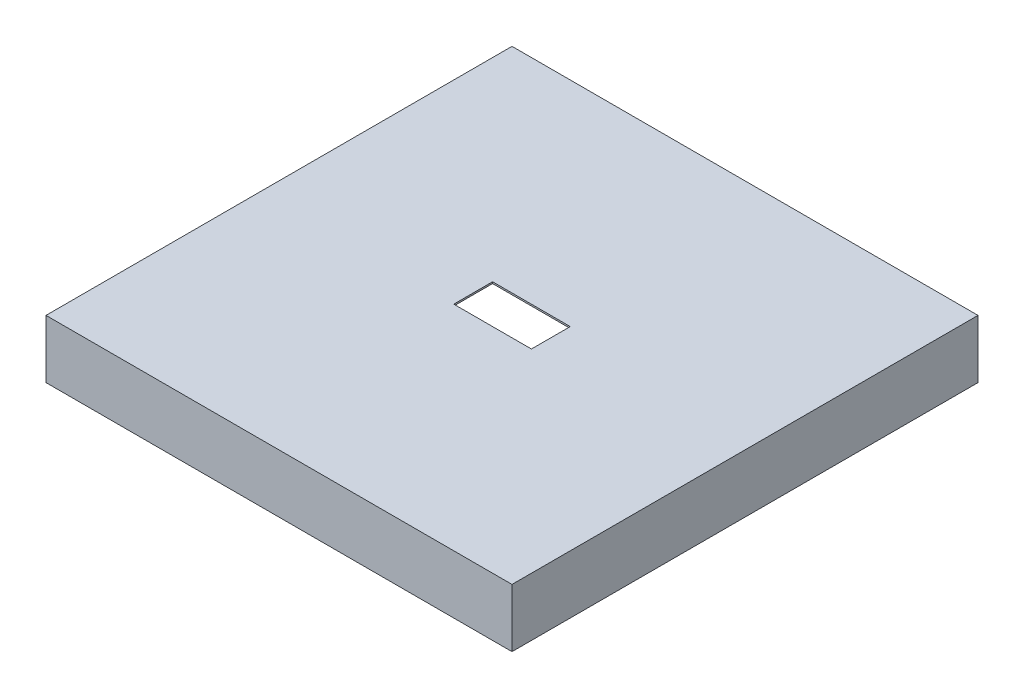
ISO-10303-21;
HEADER;
FILE_DESCRIPTION(('STEP AP214'),'2;1');
FILE_NAME('part.step','',(''),(''),'','','');
FILE_SCHEMA(('AUTOMOTIVE_DESIGN { 1 0 10303 214 1 1 1 1 }'));
ENDSEC;
DATA;
#1=APPLICATION_CONTEXT('core data for automotive mechanical design processes');
#2=APPLICATION_PROTOCOL_DEFINITION('international standard','automotive_design',2000,#1);
#3=PRODUCT_CONTEXT('',#1,'mechanical');
#4=PRODUCT('Part','Part','',(#3));
#5=PRODUCT_RELATED_PRODUCT_CATEGORY('part','',(#4));
#6=PRODUCT_DEFINITION_FORMATION('','',#4);
#7=PRODUCT_DEFINITION_CONTEXT('part definition',#1,'design');
#8=PRODUCT_DEFINITION('design','',#6,#7);
#9=PRODUCT_DEFINITION_SHAPE('','',#8);
#10=(LENGTH_UNIT() NAMED_UNIT(*) SI_UNIT(.MILLI.,.METRE.));
#11=(NAMED_UNIT(*) PLANE_ANGLE_UNIT() SI_UNIT($,.RADIAN.));
#12=(NAMED_UNIT(*) SI_UNIT($,.STERADIAN.) SOLID_ANGLE_UNIT());
#13=UNCERTAINTY_MEASURE_WITH_UNIT(LENGTH_MEASURE(1.E-05),#10,'distance_accuracy_value','');
#14=(GEOMETRIC_REPRESENTATION_CONTEXT(3) GLOBAL_UNCERTAINTY_ASSIGNED_CONTEXT((#13)) GLOBAL_UNIT_ASSIGNED_CONTEXT((#10,
#11,#12)) REPRESENTATION_CONTEXT('',''));
#15=CARTESIAN_POINT('',(0.,0.,0.));
#16=DIRECTION('',(0.,0.,1.));
#17=DIRECTION('',(1.,0.,0.));
#18=AXIS2_PLACEMENT_3D('',#15,#16,#17);
#19=CARTESIAN_POINT('',(-1739.9,444.5,0.));
#20=DIRECTION('',(1.,0.,0.));
#21=DIRECTION('',(0.,0.,-1.));
#22=AXIS2_PLACEMENT_3D('',#19,#20,#21);
#23=PLANE('',#22);
#24=DIRECTION('',(0.,0.,1.));
#25=VECTOR('',#24,1.);
#26=CARTESIAN_POINT('',(-1739.9,0.,0.));
#27=LINE('',#26,#25);
#28=CARTESIAN_POINT('',(-1739.9,0.,-1739.9));
#29=VERTEX_POINT('',#28);
#30=CARTESIAN_POINT('',(-1739.9,0.,1739.9));
#31=VERTEX_POINT('',#30);
#32=EDGE_CURVE('E215',#29,#31,#27,.T.);
#33=ORIENTED_EDGE('',*,*,#32,.F.);
#34=DIRECTION('',(0.,-1.,0.));
#35=VECTOR('',#34,1.);
#36=CARTESIAN_POINT('',(-1739.9,444.5,-1739.9));
#37=LINE('',#36,#35);
#38=CARTESIAN_POINT('',(-1739.9,444.5,-1739.9));
#39=VERTEX_POINT('',#38);
#40=EDGE_CURVE('E11',#39,#29,#37,.T.);
#41=ORIENTED_EDGE('',*,*,#40,.F.);
#42=DIRECTION('',(0.,0.,1.));
#43=VECTOR('',#42,1.);
#44=CARTESIAN_POINT('',(-1739.9,444.5,0.));
#45=LINE('',#44,#43);
#46=CARTESIAN_POINT('',(-1739.9,444.5,1739.9));
#47=VERTEX_POINT('',#46);
#48=EDGE_CURVE('E192',#39,#47,#45,.T.);
#49=ORIENTED_EDGE('',*,*,#48,.T.);
#50=DIRECTION('',(0.,-1.,0.));
#51=VECTOR('',#50,1.);
#52=CARTESIAN_POINT('',(-1739.9,444.5,1739.9));
#53=LINE('',#52,#51);
#54=EDGE_CURVE('E226',#47,#31,#53,.T.);
#55=ORIENTED_EDGE('',*,*,#54,.T.);
#56=EDGE_LOOP('',(#33,#41,#49,#55));
#57=FACE_BOUND('',#56,.T.);
#58=ADVANCED_FACE('F45',(#57),#23,.T.);
#59=CARTESIAN_POINT('',(0.,444.5,-1739.9));
#60=DIRECTION('',(0.,0.,-1.));
#61=DIRECTION('',(-1.,0.,0.));
#62=AXIS2_PLACEMENT_3D('',#59,#60,#61);
#63=PLANE('',#62);
#64=DIRECTION('',(1.,0.,0.));
#65=VECTOR('',#64,1.);
#66=CARTESIAN_POINT('',(0.,0.,-1739.9));
#67=LINE('',#66,#65);
#68=CARTESIAN_POINT('',(1739.9,0.,-1739.9));
#69=VERTEX_POINT('',#68);
#70=EDGE_CURVE('E218',#29,#69,#67,.T.);
#71=ORIENTED_EDGE('',*,*,#70,.T.);
#72=DIRECTION('',(0.,-1.,0.));
#73=VECTOR('',#72,1.);
#74=CARTESIAN_POINT('',(1739.9,444.5,-1739.9));
#75=LINE('',#74,#73);
#76=CARTESIAN_POINT('',(1739.9,444.5,-1739.9));
#77=VERTEX_POINT('',#76);
#78=EDGE_CURVE('E54',#77,#69,#75,.T.);
#79=ORIENTED_EDGE('',*,*,#78,.F.);
#80=DIRECTION('',(1.,0.,0.));
#81=VECTOR('',#80,1.);
#82=CARTESIAN_POINT('',(0.,444.5,-1739.9));
#83=LINE('',#82,#81);
#84=EDGE_CURVE('E195',#39,#77,#83,.T.);
#85=ORIENTED_EDGE('',*,*,#84,.F.);
#86=ORIENTED_EDGE('',*,*,#40,.T.);
#87=EDGE_LOOP('',(#71,#79,#85,#86));
#88=FACE_BOUND('',#87,.T.);
#89=ADVANCED_FACE('F266',(#88),#63,.F.);
#90=CARTESIAN_POINT('',(1739.9,444.5,-1.11022302462516E-13));
#91=DIRECTION('',(1.,0.,0.));
#92=DIRECTION('',(0.,0.,-1.));
#93=AXIS2_PLACEMENT_3D('',#90,#91,#92);
#94=PLANE('',#93);
#95=DIRECTION('',(0.,0.,1.));
#96=VECTOR('',#95,1.);
#97=CARTESIAN_POINT('',(1739.9,0.,-1.11022302462516E-13));
#98=LINE('',#97,#96);
#99=CARTESIAN_POINT('',(1739.9,0.,1739.9));
#100=VERTEX_POINT('',#99);
#101=EDGE_CURVE('E221',#69,#100,#98,.T.);
#102=ORIENTED_EDGE('',*,*,#101,.T.);
#103=DIRECTION('',(0.,-1.,0.));
#104=VECTOR('',#103,1.);
#105=CARTESIAN_POINT('',(1739.9,444.5,1739.9));
#106=LINE('',#105,#104);
#107=CARTESIAN_POINT('',(1739.9,444.5,1739.9));
#108=VERTEX_POINT('',#107);
#109=EDGE_CURVE('E228',#108,#100,#106,.T.);
#110=ORIENTED_EDGE('',*,*,#109,.F.);
#111=DIRECTION('',(0.,0.,1.));
#112=VECTOR('',#111,1.);
#113=CARTESIAN_POINT('',(1739.9,444.5,-1.11022302462516E-13));
#114=LINE('',#113,#112);
#115=EDGE_CURVE('E199',#77,#108,#114,.T.);
#116=ORIENTED_EDGE('',*,*,#115,.F.);
#117=ORIENTED_EDGE('',*,*,#78,.T.);
#118=EDGE_LOOP('',(#102,#110,#116,#117));
#119=FACE_BOUND('',#118,.T.);
#120=ADVANCED_FACE('F273',(#119),#94,.F.);
#121=CARTESIAN_POINT('',(1828.8,444.5,-2.22044604925031E-13));
#122=DIRECTION('',(1.,0.,0.));
#123=DIRECTION('',(0.,0.,-1.));
#124=AXIS2_PLACEMENT_3D('',#121,#122,#123);
#125=PLANE('',#124);
#126=DIRECTION('',(0.,0.,1.));
#127=VECTOR('',#126,1.);
#128=CARTESIAN_POINT('',(1828.8,0.,-2.22044604925031E-13));
#129=LINE('',#128,#127);
#130=CARTESIAN_POINT('',(1828.8,0.,-1828.8));
#131=VERTEX_POINT('',#130);
#132=CARTESIAN_POINT('',(1828.8,0.,1828.8));
#133=VERTEX_POINT('',#132);
#134=EDGE_CURVE('E191',#131,#133,#129,.T.);
#135=ORIENTED_EDGE('',*,*,#134,.F.);
#136=DIRECTION('',(0.,-1.,0.));
#137=VECTOR('',#136,1.);
#138=CARTESIAN_POINT('',(1828.8,444.5,-1828.8));
#139=LINE('',#138,#137);
#140=CARTESIAN_POINT('',(1828.8,457.2,-1828.8));
#141=VERTEX_POINT('',#140);
#142=EDGE_CURVE('E49',#141,#131,#139,.T.);
#143=ORIENTED_EDGE('',*,*,#142,.F.);
#144=DIRECTION('',(0.,0.,-1.));
#145=VECTOR('',#144,1.);
#146=CARTESIAN_POINT('',(1828.8,457.2,1828.8));
#147=LINE('',#146,#145);
#148=CARTESIAN_POINT('',(1828.8,457.2,1828.8));
#149=VERTEX_POINT('',#148);
#150=EDGE_CURVE('E181',#149,#141,#147,.T.);
#151=ORIENTED_EDGE('',*,*,#150,.F.);
#152=DIRECTION('',(0.,-1.,0.));
#153=VECTOR('',#152,1.);
#154=CARTESIAN_POINT('',(1828.8,444.5,1828.8));
#155=LINE('',#154,#153);
#156=EDGE_CURVE('E204',#149,#133,#155,.T.);
#157=ORIENTED_EDGE('',*,*,#156,.T.);
#158=EDGE_LOOP('',(#135,#143,#151,#157));
#159=FACE_BOUND('',#158,.T.);
#160=ADVANCED_FACE('F47',(#159),#125,.T.);
#161=CARTESIAN_POINT('',(0.,444.5,-1828.8));
#162=DIRECTION('',(0.,0.,-1.));
#163=DIRECTION('',(-1.,0.,0.));
#164=AXIS2_PLACEMENT_3D('',#161,#162,#163);
#165=PLANE('',#164);
#166=DIRECTION('',(1.,0.,0.));
#167=VECTOR('',#166,1.);
#168=CARTESIAN_POINT('',(0.,0.,-1828.8));
#169=LINE('',#168,#167);
#170=CARTESIAN_POINT('',(-1828.8,0.,-1828.8));
#171=VERTEX_POINT('',#170);
#172=EDGE_CURVE('E207',#171,#131,#169,.T.);
#173=ORIENTED_EDGE('',*,*,#172,.F.);
#174=DIRECTION('',(0.,-1.,0.));
#175=VECTOR('',#174,1.);
#176=CARTESIAN_POINT('',(-1828.8,444.5,-1828.8));
#177=LINE('',#176,#175);
#178=CARTESIAN_POINT('',(-1828.8,457.2,-1828.8));
#179=VERTEX_POINT('',#178);
#180=EDGE_CURVE('E235',#179,#171,#177,.T.);
#181=ORIENTED_EDGE('',*,*,#180,.F.);
#182=DIRECTION('',(-1.,0.,0.));
#183=VECTOR('',#182,1.);
#184=CARTESIAN_POINT('',(1828.8,457.2,-1828.8));
#185=LINE('',#184,#183);
#186=EDGE_CURVE('E184',#141,#179,#185,.T.);
#187=ORIENTED_EDGE('',*,*,#186,.F.);
#188=ORIENTED_EDGE('',*,*,#142,.T.);
#189=EDGE_LOOP('',(#173,#181,#187,#188));
#190=FACE_BOUND('',#189,.T.);
#191=ADVANCED_FACE('F243',(#190),#165,.T.);
#192=CARTESIAN_POINT('',(-1828.8,444.5,2.22044604925031E-13));
#193=DIRECTION('',(1.,0.,0.));
#194=DIRECTION('',(0.,0.,-1.));
#195=AXIS2_PLACEMENT_3D('',#192,#193,#194);
#196=PLANE('',#195);
#197=DIRECTION('',(0.,0.,1.));
#198=VECTOR('',#197,1.);
#199=CARTESIAN_POINT('',(-1828.8,0.,2.22044604925031E-13));
#200=LINE('',#199,#198);
#201=CARTESIAN_POINT('',(-1828.8,0.,1828.8));
#202=VERTEX_POINT('',#201);
#203=EDGE_CURVE('E210',#171,#202,#200,.T.);
#204=ORIENTED_EDGE('',*,*,#203,.T.);
#205=DIRECTION('',(0.,-1.,0.));
#206=VECTOR('',#205,1.);
#207=CARTESIAN_POINT('',(-1828.8,444.5,1828.8));
#208=LINE('',#207,#206);
#209=CARTESIAN_POINT('',(-1828.8,457.2,1828.8));
#210=VERTEX_POINT('',#209);
#211=EDGE_CURVE('E233',#210,#202,#208,.T.);
#212=ORIENTED_EDGE('',*,*,#211,.F.);
#213=DIRECTION('',(0.,0.,1.));
#214=VECTOR('',#213,1.);
#215=CARTESIAN_POINT('',(-1828.8,457.2,-1828.8));
#216=LINE('',#215,#214);
#217=EDGE_CURVE('E188',#179,#210,#216,.T.);
#218=ORIENTED_EDGE('',*,*,#217,.F.);
#219=ORIENTED_EDGE('',*,*,#180,.T.);
#220=EDGE_LOOP('',(#204,#212,#218,#219));
#221=FACE_BOUND('',#220,.T.);
#222=ADVANCED_FACE('F250',(#221),#196,.F.);
#223=CARTESIAN_POINT('',(0.,444.5,1828.8));
#224=DIRECTION('',(0.,0.,-1.));
#225=DIRECTION('',(-1.,0.,0.));
#226=AXIS2_PLACEMENT_3D('',#223,#224,#225);
#227=PLANE('',#226);
#228=DIRECTION('',(1.,0.,0.));
#229=VECTOR('',#228,1.);
#230=CARTESIAN_POINT('',(0.,0.,1828.8));
#231=LINE('',#230,#229);
#232=EDGE_CURVE('E212',#202,#133,#231,.T.);
#233=ORIENTED_EDGE('',*,*,#232,.T.);
#234=ORIENTED_EDGE('',*,*,#156,.F.);
#235=DIRECTION('',(1.,0.,0.));
#236=VECTOR('',#235,1.);
#237=CARTESIAN_POINT('',(-1828.8,457.2,1828.8));
#238=LINE('',#237,#236);
#239=EDGE_CURVE('E178',#210,#149,#238,.T.);
#240=ORIENTED_EDGE('',*,*,#239,.F.);
#241=ORIENTED_EDGE('',*,*,#211,.T.);
#242=EDGE_LOOP('',(#233,#234,#240,#241));
#243=FACE_BOUND('',#242,.T.);
#244=ADVANCED_FACE('F253',(#243),#227,.F.);
#245=CARTESIAN_POINT('',(1.11022302462516E-13,444.5,1739.9));
#246=DIRECTION('',(0.,0.,-1.));
#247=DIRECTION('',(-1.,0.,0.));
#248=AXIS2_PLACEMENT_3D('',#245,#246,#247);
#249=PLANE('',#248);
#250=DIRECTION('',(1.,0.,0.));
#251=VECTOR('',#250,1.);
#252=CARTESIAN_POINT('',(1.11022302462516E-13,0.,1739.9));
#253=LINE('',#252,#251);
#254=EDGE_CURVE('E196',#31,#100,#253,.T.);
#255=ORIENTED_EDGE('',*,*,#254,.F.);
#256=ORIENTED_EDGE('',*,*,#54,.F.);
#257=DIRECTION('',(1.,0.,0.));
#258=VECTOR('',#257,1.);
#259=CARTESIAN_POINT('',(1.11022302462516E-13,444.5,1739.9));
#260=LINE('',#259,#258);
#261=EDGE_CURVE('E201',#47,#108,#260,.T.);
#262=ORIENTED_EDGE('',*,*,#261,.T.);
#263=ORIENTED_EDGE('',*,*,#109,.T.);
#264=EDGE_LOOP('',(#255,#256,#262,#263));
#265=FACE_BOUND('',#264,.T.);
#266=ADVANCED_FACE('F281',(#265),#249,.T.);
#267=CARTESIAN_POINT('',(0.,0.,0.));
#268=DIRECTION('',(0.,1.,0.));
#269=DIRECTION('',(0.,0.,1.));
#270=AXIS2_PLACEMENT_3D('',#267,#268,#269);
#271=PLANE('',#270);
#272=ORIENTED_EDGE('',*,*,#134,.T.);
#273=ORIENTED_EDGE('',*,*,#232,.F.);
#274=ORIENTED_EDGE('',*,*,#203,.F.);
#275=ORIENTED_EDGE('',*,*,#172,.T.);
#276=EDGE_LOOP('',(#272,#273,#274,#275));
#277=FACE_BOUND('',#276,.T.);
#278=ORIENTED_EDGE('',*,*,#32,.T.);
#279=ORIENTED_EDGE('',*,*,#254,.T.);
#280=ORIENTED_EDGE('',*,*,#101,.F.);
#281=ORIENTED_EDGE('',*,*,#70,.F.);
#282=EDGE_LOOP('',(#278,#279,#280,#281));
#283=FACE_BOUND('',#282,.T.);
#284=ADVANCED_FACE('F248',(#277,#283),#271,.F.);
#285=CARTESIAN_POINT('',(0.,444.5,0.));
#286=DIRECTION('',(0.,1.,0.));
#287=DIRECTION('',(0.,0.,1.));
#288=AXIS2_PLACEMENT_3D('',#285,#286,#287);
#289=PLANE('',#288);
#290=DIRECTION('',(1.,0.,0.));
#291=VECTOR('',#290,1.);
#292=CARTESIAN_POINT('',(0.,444.5,152.4));
#293=LINE('',#292,#291);
#294=CARTESIAN_POINT('',(-304.8,444.5,152.4));
#295=VERTEX_POINT('',#294);
#296=CARTESIAN_POINT('',(304.8,444.5,152.4));
#297=VERTEX_POINT('',#296);
#298=EDGE_CURVE('E171',#295,#297,#293,.T.);
#299=ORIENTED_EDGE('',*,*,#298,.T.);
#300=DIRECTION('',(0.,0.,-1.));
#301=VECTOR('',#300,1.);
#302=CARTESIAN_POINT('',(304.8,444.5,0.));
#303=LINE('',#302,#301);
#304=CARTESIAN_POINT('',(304.8,444.5,-152.4));
#305=VERTEX_POINT('',#304);
#306=EDGE_CURVE('E174',#297,#305,#303,.T.);
#307=ORIENTED_EDGE('',*,*,#306,.T.);
#308=DIRECTION('',(-1.,0.,0.));
#309=VECTOR('',#308,1.);
#310=CARTESIAN_POINT('',(0.,444.5,-152.4));
#311=LINE('',#310,#309);
#312=CARTESIAN_POINT('',(-304.8,444.5,-152.4));
#313=VERTEX_POINT('',#312);
#314=EDGE_CURVE('E164',#305,#313,#311,.T.);
#315=ORIENTED_EDGE('',*,*,#314,.T.);
#316=DIRECTION('',(0.,0.,1.));
#317=VECTOR('',#316,1.);
#318=CARTESIAN_POINT('',(-304.8,444.5,0.));
#319=LINE('',#318,#317);
#320=EDGE_CURVE('E143',#313,#295,#319,.T.);
#321=ORIENTED_EDGE('',*,*,#320,.T.);
#322=EDGE_LOOP('',(#299,#307,#315,#321));
#323=FACE_BOUND('',#322,.T.);
#324=ORIENTED_EDGE('',*,*,#48,.F.);
#325=ORIENTED_EDGE('',*,*,#84,.T.);
#326=ORIENTED_EDGE('',*,*,#115,.T.);
#327=ORIENTED_EDGE('',*,*,#261,.F.);
#328=EDGE_LOOP('',(#324,#325,#326,#327));
#329=FACE_BOUND('',#328,.T.);
#330=ADVANCED_FACE('F256',(#323,#329),#289,.F.);
#331=CARTESIAN_POINT('',(0.,457.2,0.));
#332=DIRECTION('',(0.,1.,0.));
#333=DIRECTION('',(0.,0.,1.));
#334=AXIS2_PLACEMENT_3D('',#331,#332,#333);
#335=PLANE('',#334);
#336=DIRECTION('',(0.,0.,-1.));
#337=VECTOR('',#336,1.);
#338=CARTESIAN_POINT('',(304.8,457.2,152.4));
#339=LINE('',#338,#337);
#340=CARTESIAN_POINT('',(304.8,457.2,152.4));
#341=VERTEX_POINT('',#340);
#342=CARTESIAN_POINT('',(304.8,457.2,-152.4));
#343=VERTEX_POINT('',#342);
#344=EDGE_CURVE('E72',#341,#343,#339,.T.);
#345=ORIENTED_EDGE('',*,*,#344,.F.);
#346=DIRECTION('',(1.,0.,0.));
#347=VECTOR('',#346,1.);
#348=CARTESIAN_POINT('',(-304.8,457.2,152.4));
#349=LINE('',#348,#347);
#350=CARTESIAN_POINT('',(-304.8,457.2,152.4));
#351=VERTEX_POINT('',#350);
#352=EDGE_CURVE('E157',#351,#341,#349,.T.);
#353=ORIENTED_EDGE('',*,*,#352,.F.);
#354=DIRECTION('',(0.,0.,1.));
#355=VECTOR('',#354,1.);
#356=CARTESIAN_POINT('',(-304.8,457.2,152.4));
#357=LINE('',#356,#355);
#358=CARTESIAN_POINT('',(-304.8,457.2,-152.4));
#359=VERTEX_POINT('',#358);
#360=EDGE_CURVE('E140',#359,#351,#357,.T.);
#361=ORIENTED_EDGE('',*,*,#360,.F.);
#362=DIRECTION('',(-1.,0.,0.));
#363=VECTOR('',#362,1.);
#364=CARTESIAN_POINT('',(-304.8,457.2,-152.4));
#365=LINE('',#364,#363);
#366=EDGE_CURVE('E149',#343,#359,#365,.T.);
#367=ORIENTED_EDGE('',*,*,#366,.F.);
#368=EDGE_LOOP('',(#345,#353,#361,#367));
#369=FACE_BOUND('',#368,.T.);
#370=ORIENTED_EDGE('',*,*,#239,.T.);
#371=ORIENTED_EDGE('',*,*,#150,.T.);
#372=ORIENTED_EDGE('',*,*,#186,.T.);
#373=ORIENTED_EDGE('',*,*,#217,.T.);
#374=EDGE_LOOP('',(#370,#371,#372,#373));
#375=FACE_BOUND('',#374,.T.);
#376=ADVANCED_FACE('F154',(#369,#375),#335,.T.);
#377=CARTESIAN_POINT('',(304.8,0.,152.4));
#378=DIRECTION('',(1.,0.,0.));
#379=DIRECTION('',(0.,0.,-1.));
#380=AXIS2_PLACEMENT_3D('',#377,#378,#379);
#381=PLANE('',#380);
#382=DIRECTION('',(0.,1.,0.));
#383=VECTOR('',#382,1.);
#384=CARTESIAN_POINT('',(304.8,0.,152.4));
#385=LINE('',#384,#383);
#386=EDGE_CURVE('E162',#297,#341,#385,.T.);
#387=ORIENTED_EDGE('',*,*,#386,.T.);
#388=ORIENTED_EDGE('',*,*,#344,.T.);
#389=DIRECTION('',(0.,1.,0.));
#390=VECTOR('',#389,1.);
#391=CARTESIAN_POINT('',(304.8,0.,-152.4));
#392=LINE('',#391,#390);
#393=EDGE_CURVE('E146',#305,#343,#392,.T.);
#394=ORIENTED_EDGE('',*,*,#393,.F.);
#395=ORIENTED_EDGE('',*,*,#306,.F.);
#396=EDGE_LOOP('',(#387,#388,#394,#395));
#397=FACE_BOUND('',#396,.T.);
#398=ADVANCED_FACE('F255',(#397),#381,.F.);
#399=CARTESIAN_POINT('',(-304.8,0.,152.4));
#400=DIRECTION('',(0.,0.,1.));
#401=DIRECTION('',(1.,0.,0.));
#402=AXIS2_PLACEMENT_3D('',#399,#400,#401);
#403=PLANE('',#402);
#404=DIRECTION('',(0.,1.,0.));
#405=VECTOR('',#404,1.);
#406=CARTESIAN_POINT('',(-304.8,0.,152.4));
#407=LINE('',#406,#405);
#408=EDGE_CURVE('E145',#295,#351,#407,.T.);
#409=ORIENTED_EDGE('',*,*,#408,.T.);
#410=ORIENTED_EDGE('',*,*,#352,.T.);
#411=ORIENTED_EDGE('',*,*,#386,.F.);
#412=ORIENTED_EDGE('',*,*,#298,.F.);
#413=EDGE_LOOP('',(#409,#410,#411,#412));
#414=FACE_BOUND('',#413,.T.);
#415=ADVANCED_FACE('F261',(#414),#403,.F.);
#416=CARTESIAN_POINT('',(-304.8,0.,152.4));
#417=DIRECTION('',(-1.,0.,0.));
#418=DIRECTION('',(0.,0.,1.));
#419=AXIS2_PLACEMENT_3D('',#416,#417,#418);
#420=PLANE('',#419);
#421=DIRECTION('',(0.,1.,0.));
#422=VECTOR('',#421,1.);
#423=CARTESIAN_POINT('',(-304.8,0.,-152.4));
#424=LINE('',#423,#422);
#425=EDGE_CURVE('E62',#313,#359,#424,.T.);
#426=ORIENTED_EDGE('',*,*,#425,.T.);
#427=ORIENTED_EDGE('',*,*,#360,.T.);
#428=ORIENTED_EDGE('',*,*,#408,.F.);
#429=ORIENTED_EDGE('',*,*,#320,.F.);
#430=EDGE_LOOP('',(#426,#427,#428,#429));
#431=FACE_BOUND('',#430,.T.);
#432=ADVANCED_FACE('F137',(#431),#420,.F.);
#433=CARTESIAN_POINT('',(-304.8,0.,-152.4));
#434=DIRECTION('',(0.,0.,-1.));
#435=DIRECTION('',(-1.,0.,0.));
#436=AXIS2_PLACEMENT_3D('',#433,#434,#435);
#437=PLANE('',#436);
#438=ORIENTED_EDGE('',*,*,#393,.T.);
#439=ORIENTED_EDGE('',*,*,#366,.T.);
#440=ORIENTED_EDGE('',*,*,#425,.F.);
#441=ORIENTED_EDGE('',*,*,#314,.F.);
#442=EDGE_LOOP('',(#438,#439,#440,#441));
#443=FACE_BOUND('',#442,.T.);
#444=ADVANCED_FACE('F150',(#443),#437,.F.);
#445=CLOSED_SHELL('',(#58,#89,#120,#160,#191,#222,#244,#266,#284,#330,#376,#398,#415,#432,#444));
#446=MANIFOLD_SOLID_BREP('B2',#445);
#447=ADVANCED_BREP_SHAPE_REPRESENTATION('',(#18,#446),#14);
#448=SHAPE_DEFINITION_REPRESENTATION(#9,#447);
ENDSEC;
END-ISO-10303-21;
